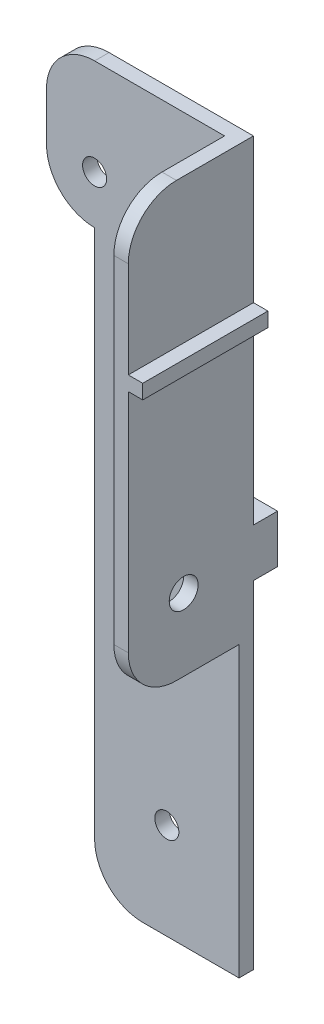
ISO-10303-21;
HEADER;
FILE_DESCRIPTION(('STEP AP214'),'2;1');
FILE_NAME('part.step','',(''),(''),'','','');
FILE_SCHEMA(('AUTOMOTIVE_DESIGN { 1 0 10303 214 1 1 1 1 }'));
ENDSEC;
DATA;
#1=APPLICATION_CONTEXT('core data for automotive mechanical design processes');
#2=APPLICATION_PROTOCOL_DEFINITION('international standard','automotive_design',2000,#1);
#3=PRODUCT_CONTEXT('',#1,'mechanical');
#4=PRODUCT('Part','Part','',(#3));
#5=PRODUCT_RELATED_PRODUCT_CATEGORY('part','',(#4));
#6=PRODUCT_DEFINITION_FORMATION('','',#4);
#7=PRODUCT_DEFINITION_CONTEXT('part definition',#1,'design');
#8=PRODUCT_DEFINITION('design','',#6,#7);
#9=PRODUCT_DEFINITION_SHAPE('','',#8);
#10=(LENGTH_UNIT() NAMED_UNIT(*) SI_UNIT(.MILLI.,.METRE.));
#11=(NAMED_UNIT(*) PLANE_ANGLE_UNIT() SI_UNIT($,.RADIAN.));
#12=(NAMED_UNIT(*) SI_UNIT($,.STERADIAN.) SOLID_ANGLE_UNIT());
#13=UNCERTAINTY_MEASURE_WITH_UNIT(LENGTH_MEASURE(1.E-05),#10,'distance_accuracy_value','');
#14=(GEOMETRIC_REPRESENTATION_CONTEXT(3) GLOBAL_UNCERTAINTY_ASSIGNED_CONTEXT((#13)) GLOBAL_UNIT_ASSIGNED_CONTEXT((#10,
#11,#12)) REPRESENTATION_CONTEXT('',''));
#15=CARTESIAN_POINT('',(0.,0.,0.));
#16=DIRECTION('',(0.,0.,1.));
#17=DIRECTION('',(1.,0.,0.));
#18=AXIS2_PLACEMENT_3D('',#15,#16,#17);
#19=CARTESIAN_POINT('',(30.,0.,-3.));
#20=DIRECTION('',(1.,0.,0.));
#21=DIRECTION('',(0.,0.,-1.));
#22=AXIS2_PLACEMENT_3D('',#19,#20,#21);
#23=PLANE('',#22);
#24=DIRECTION('',(0.,0.,1.));
#25=VECTOR('',#24,1.);
#26=CARTESIAN_POINT('',(30.,150.,-3.));
#27=LINE('',#26,#25);
#28=CARTESIAN_POINT('',(30.,150.,-3.));
#29=VERTEX_POINT('',#28);
#30=CARTESIAN_POINT('',(30.,150.,13.));
#31=VERTEX_POINT('',#30);
#32=EDGE_CURVE('E276',#29,#31,#27,.T.);
#33=ORIENTED_EDGE('',*,*,#32,.T.);
#34=CARTESIAN_POINT('',(30.,140.,13.));
#35=DIRECTION('',(1.,0.,0.));
#36=DIRECTION('',(0.,0.,-1.));
#37=AXIS2_PLACEMENT_3D('',#34,#35,#36);
#38=CIRCLE('',#37,10.);
#39=CARTESIAN_POINT('',(30.,140.,23.));
#40=VERTEX_POINT('',#39);
#41=EDGE_CURVE('E314',#31,#40,#38,.T.);
#42=ORIENTED_EDGE('',*,*,#41,.T.);
#43=DIRECTION('',(0.,-1.,0.));
#44=VECTOR('',#43,1.);
#45=CARTESIAN_POINT('',(30.,150.,23.));
#46=LINE('',#45,#44);
#47=CARTESIAN_POINT('',(30.,120.,23.));
#48=VERTEX_POINT('',#47);
#49=EDGE_CURVE('E213',#40,#48,#46,.T.);
#50=ORIENTED_EDGE('',*,*,#49,.T.);
#51=DIRECTION('',(0.,0.,-1.));
#52=VECTOR('',#51,1.);
#53=CARTESIAN_POINT('',(30.,120.,0.));
#54=LINE('',#53,#52);
#55=CARTESIAN_POINT('',(30.,120.,-3.));
#56=VERTEX_POINT('',#55);
#57=EDGE_CURVE('E704',#48,#56,#54,.T.);
#58=ORIENTED_EDGE('',*,*,#57,.T.);
#59=DIRECTION('',(0.,1.,0.));
#60=VECTOR('',#59,1.);
#61=CARTESIAN_POINT('',(30.,0.,-3.));
#62=LINE('',#61,#60);
#63=EDGE_CURVE('E266',#56,#29,#62,.T.);
#64=ORIENTED_EDGE('',*,*,#63,.T.);
#65=EDGE_LOOP('',(#33,#42,#50,#58,#64));
#66=FACE_BOUND('',#65,.T.);
#67=ADVANCED_FACE('F34',(#66),#23,.T.);
#68=CARTESIAN_POINT('',(0.,0.,-3.));
#69=DIRECTION('',(1.,0.,0.));
#70=DIRECTION('',(0.,0.,-1.));
#71=AXIS2_PLACEMENT_3D('',#68,#69,#70);
#72=PLANE('',#71);
#73=DIRECTION('',(0.,1.,0.));
#74=VECTOR('',#73,1.);
#75=CARTESIAN_POINT('',(0.,0.,-3.));
#76=LINE('',#75,#74);
#77=CARTESIAN_POINT('',(0.,10.,-3.));
#78=VERTEX_POINT('',#77);
#79=CARTESIAN_POINT('',(0.,70.,-3.));
#80=VERTEX_POINT('',#79);
#81=EDGE_CURVE('E223',#78,#80,#76,.T.);
#82=ORIENTED_EDGE('',*,*,#81,.F.);
#83=DIRECTION('',(0.,0.,1.));
#84=VECTOR('',#83,1.);
#85=CARTESIAN_POINT('',(0.,10.,0.));
#86=LINE('',#85,#84);
#87=CARTESIAN_POINT('',(0.,10.,0.));
#88=VERTEX_POINT('',#87);
#89=EDGE_CURVE('E289',#78,#88,#86,.T.);
#90=ORIENTED_EDGE('',*,*,#89,.T.);
#91=DIRECTION('',(0.,1.,0.));
#92=VECTOR('',#91,1.);
#93=CARTESIAN_POINT('',(0.,0.,0.));
#94=LINE('',#93,#92);
#95=CARTESIAN_POINT('',(0.,120.,0.));
#96=VERTEX_POINT('',#95);
#97=EDGE_CURVE('E263',#88,#96,#94,.T.);
#98=ORIENTED_EDGE('',*,*,#97,.T.);
#99=DIRECTION('',(0.,0.,1.));
#100=VECTOR('',#99,1.);
#101=CARTESIAN_POINT('',(0.,120.,-3.));
#102=LINE('',#101,#100);
#103=CARTESIAN_POINT('',(0.,120.,-3.));
#104=VERTEX_POINT('',#103);
#105=EDGE_CURVE('E286',#104,#96,#102,.T.);
#106=ORIENTED_EDGE('',*,*,#105,.F.);
#107=DIRECTION('',(0.,1.,0.));
#108=VECTOR('',#107,1.);
#109=CARTESIAN_POINT('',(0.,0.,-3.));
#110=LINE('',#109,#108);
#111=CARTESIAN_POINT('',(0.,80.,-3.));
#112=VERTEX_POINT('',#111);
#113=EDGE_CURVE('E274',#112,#104,#110,.T.);
#114=ORIENTED_EDGE('',*,*,#113,.F.);
#115=DIRECTION('',(0.,0.,1.));
#116=VECTOR('',#115,1.);
#117=CARTESIAN_POINT('',(0.,80.,-8.));
#118=LINE('',#117,#116);
#119=CARTESIAN_POINT('',(0.,80.,-8.));
#120=VERTEX_POINT('',#119);
#121=EDGE_CURVE('E249',#120,#112,#118,.T.);
#122=ORIENTED_EDGE('',*,*,#121,.F.);
#123=DIRECTION('',(0.,-1.,0.));
#124=VECTOR('',#123,1.);
#125=CARTESIAN_POINT('',(0.,80.,-8.));
#126=LINE('',#125,#124);
#127=CARTESIAN_POINT('',(0.,70.,-8.));
#128=VERTEX_POINT('',#127);
#129=EDGE_CURVE('E236',#120,#128,#126,.T.);
#130=ORIENTED_EDGE('',*,*,#129,.T.);
#131=DIRECTION('',(0.,0.,1.));
#132=VECTOR('',#131,1.);
#133=CARTESIAN_POINT('',(0.,70.,-8.));
#134=LINE('',#133,#132);
#135=EDGE_CURVE('E248',#128,#80,#134,.T.);
#136=ORIENTED_EDGE('',*,*,#135,.T.);
#137=EDGE_LOOP('',(#82,#90,#98,#106,#114,#122,#130,#136));
#138=FACE_BOUND('',#137,.T.);
#139=ADVANCED_FACE('F342',(#138),#72,.F.);
#140=CARTESIAN_POINT('',(-9.99999999999998,0.,-3.));
#141=DIRECTION('',(-1.,0.,0.));
#142=DIRECTION('',(0.,-1.,0.));
#143=AXIS2_PLACEMENT_3D('',#140,#141,#142);
#144=PLANE('',#143);
#145=DIRECTION('',(0.,-1.,0.));
#146=VECTOR('',#145,1.);
#147=CARTESIAN_POINT('',(-9.99999999999998,0.,-3.));
#148=LINE('',#147,#146);
#149=CARTESIAN_POINT('',(-10.,140.,-3.));
#150=VERTEX_POINT('',#149);
#151=CARTESIAN_POINT('',(-10.,130.,-3.));
#152=VERTEX_POINT('',#151);
#153=EDGE_CURVE('E271',#150,#152,#148,.T.);
#154=ORIENTED_EDGE('',*,*,#153,.T.);
#155=DIRECTION('',(0.,0.,1.));
#156=VECTOR('',#155,1.);
#157=CARTESIAN_POINT('',(-10.,130.,0.));
#158=LINE('',#157,#156);
#159=CARTESIAN_POINT('',(-10.,130.,0.));
#160=VERTEX_POINT('',#159);
#161=EDGE_CURVE('E318',#152,#160,#158,.T.);
#162=ORIENTED_EDGE('',*,*,#161,.T.);
#163=DIRECTION('',(0.,-1.,0.));
#164=VECTOR('',#163,1.);
#165=CARTESIAN_POINT('',(-9.99999999999998,0.,0.));
#166=LINE('',#165,#164);
#167=CARTESIAN_POINT('',(-10.,140.,0.));
#168=VERTEX_POINT('',#167);
#169=EDGE_CURVE('E281',#168,#160,#166,.T.);
#170=ORIENTED_EDGE('',*,*,#169,.F.);
#171=DIRECTION('',(0.,0.,1.));
#172=VECTOR('',#171,1.);
#173=CARTESIAN_POINT('',(-10.,140.,-3.));
#174=LINE('',#173,#172);
#175=EDGE_CURVE('E316',#168,#150,#174,.F.);
#176=ORIENTED_EDGE('',*,*,#175,.T.);
#177=EDGE_LOOP('',(#154,#162,#170,#176));
#178=FACE_BOUND('',#177,.T.);
#179=ADVANCED_FACE('F336',(#178),#144,.T.);
#180=CARTESIAN_POINT('',(0.,150.,-3.));
#181=DIRECTION('',(0.,-1.,0.));
#182=DIRECTION('',(0.,0.,-1.));
#183=AXIS2_PLACEMENT_3D('',#180,#181,#182);
#184=PLANE('',#183);
#185=DIRECTION('',(0.,0.,-1.));
#186=VECTOR('',#185,1.);
#187=CARTESIAN_POINT('',(27.,150.,23.));
#188=LINE('',#187,#186);
#189=CARTESIAN_POINT('',(27.,150.,13.));
#190=VERTEX_POINT('',#189);
#191=CARTESIAN_POINT('',(27.,150.,0.));
#192=VERTEX_POINT('',#191);
#193=EDGE_CURVE('E201',#190,#192,#188,.T.);
#194=ORIENTED_EDGE('',*,*,#193,.F.);
#195=DIRECTION('',(-1.,0.,0.));
#196=VECTOR('',#195,1.);
#197=CARTESIAN_POINT('',(30.,150.,13.));
#198=LINE('',#197,#196);
#199=EDGE_CURVE('E312',#190,#31,#198,.F.);
#200=ORIENTED_EDGE('',*,*,#199,.T.);
#201=ORIENTED_EDGE('',*,*,#32,.F.);
#202=DIRECTION('',(1.,0.,0.));
#203=VECTOR('',#202,1.);
#204=CARTESIAN_POINT('',(0.,150.,-3.));
#205=LINE('',#204,#203);
#206=CARTESIAN_POINT('',(0.,150.,-3.));
#207=VERTEX_POINT('',#206);
#208=EDGE_CURVE('E269',#207,#29,#205,.T.);
#209=ORIENTED_EDGE('',*,*,#208,.F.);
#210=DIRECTION('',(0.,0.,1.));
#211=VECTOR('',#210,1.);
#212=CARTESIAN_POINT('',(0.,150.,0.));
#213=LINE('',#212,#211);
#214=CARTESIAN_POINT('',(0.,150.,0.));
#215=VERTEX_POINT('',#214);
#216=EDGE_CURVE('E309',#207,#215,#213,.T.);
#217=ORIENTED_EDGE('',*,*,#216,.T.);
#218=DIRECTION('',(1.,0.,0.));
#219=VECTOR('',#218,1.);
#220=CARTESIAN_POINT('',(0.,150.,0.));
#221=LINE('',#220,#219);
#222=EDGE_CURVE('E279',#215,#192,#221,.T.);
#223=ORIENTED_EDGE('',*,*,#222,.T.);
#224=EDGE_LOOP('',(#194,#200,#201,#209,#217,#223));
#225=FACE_BOUND('',#224,.T.);
#226=ADVANCED_FACE('F423',(#225),#184,.F.);
#227=CARTESIAN_POINT('',(0.,130.,-3.));
#228=DIRECTION('',(0.,0.,1.));
#229=DIRECTION('',(1.,0.,0.));
#230=AXIS2_PLACEMENT_3D('',#227,#228,#229);
#231=CYLINDRICAL_SURFACE('',#230,2.5);
#232=CARTESIAN_POINT('',(0.,130.,-3.));
#233=DIRECTION('',(0.,0.,1.));
#234=DIRECTION('',(1.,0.,0.));
#235=AXIS2_PLACEMENT_3D('',#232,#233,#234);
#236=CIRCLE('',#235,2.5);
#237=CARTESIAN_POINT('',(2.5,130.,-3.));
#238=VERTEX_POINT('',#237);
#239=EDGE_CURVE('E259',#238,#238,#236,.T.);
#240=ORIENTED_EDGE('',*,*,#239,.F.);
#241=EDGE_LOOP('',(#240));
#242=FACE_BOUND('',#241,.T.);
#243=CARTESIAN_POINT('',(0.,130.,0.));
#244=DIRECTION('',(0.,0.,1.));
#245=DIRECTION('',(1.,0.,0.));
#246=AXIS2_PLACEMENT_3D('',#243,#244,#245);
#247=CIRCLE('',#246,2.5);
#248=CARTESIAN_POINT('',(2.5,130.,0.));
#249=VERTEX_POINT('',#248);
#250=EDGE_CURVE('E251',#249,#249,#247,.T.);
#251=ORIENTED_EDGE('',*,*,#250,.T.);
#252=EDGE_LOOP('',(#251));
#253=FACE_BOUND('',#252,.T.);
#254=ADVANCED_FACE('F415',(#242,#253),#231,.F.);
#255=CARTESIAN_POINT('',(30.,117.,23.));
#256=VERTEX_POINT('',#255);
#257=CARTESIAN_POINT('',(30.,70.,23.));
#258=VERTEX_POINT('',#257);
#259=EDGE_CURVE('E206',#256,#258,#46,.T.);
#260=ORIENTED_EDGE('',*,*,#259,.T.);
#261=CARTESIAN_POINT('',(30.,70.,13.));
#262=DIRECTION('',(1.,0.,0.));
#263=DIRECTION('',(0.,0.,-1.));
#264=AXIS2_PLACEMENT_3D('',#261,#262,#263);
#265=CIRCLE('',#264,10.);
#266=CARTESIAN_POINT('',(30.,60.,13.));
#267=VERTEX_POINT('',#266);
#268=EDGE_CURVE('E11',#258,#267,#265,.T.);
#269=ORIENTED_EDGE('',*,*,#268,.T.);
#270=DIRECTION('',(0.,0.,1.));
#271=VECTOR('',#270,1.);
#272=CARTESIAN_POINT('',(30.,60.,0.));
#273=LINE('',#272,#271);
#274=CARTESIAN_POINT('',(30.,60.,0.));
#275=VERTEX_POINT('',#274);
#276=EDGE_CURVE('E197',#275,#267,#273,.T.);
#277=ORIENTED_EDGE('',*,*,#276,.F.);
#278=DIRECTION('',(0.,1.,0.));
#279=VECTOR('',#278,1.);
#280=CARTESIAN_POINT('',(30.,0.,0.));
#281=LINE('',#280,#279);
#282=CARTESIAN_POINT('',(30.,0.,0.));
#283=VERTEX_POINT('',#282);
#284=EDGE_CURVE('E186',#283,#275,#281,.T.);
#285=ORIENTED_EDGE('',*,*,#284,.F.);
#286=DIRECTION('',(0.,0.,1.));
#287=VECTOR('',#286,1.);
#288=CARTESIAN_POINT('',(30.,0.,-3.));
#289=LINE('',#288,#287);
#290=CARTESIAN_POINT('',(30.,0.,-3.));
#291=VERTEX_POINT('',#290);
#292=EDGE_CURVE('E230',#291,#283,#289,.T.);
#293=ORIENTED_EDGE('',*,*,#292,.F.);
#294=DIRECTION('',(0.,1.,0.));
#295=VECTOR('',#294,1.);
#296=CARTESIAN_POINT('',(30.,0.,-3.));
#297=LINE('',#296,#295);
#298=CARTESIAN_POINT('',(30.,70.,-3.));
#299=VERTEX_POINT('',#298);
#300=EDGE_CURVE('E227',#291,#299,#297,.T.);
#301=ORIENTED_EDGE('',*,*,#300,.T.);
#302=DIRECTION('',(0.,0.,1.));
#303=VECTOR('',#302,1.);
#304=CARTESIAN_POINT('',(30.,70.,-8.));
#305=LINE('',#304,#303);
#306=CARTESIAN_POINT('',(30.,70.,-8.));
#307=VERTEX_POINT('',#306);
#308=EDGE_CURVE('E255',#307,#299,#305,.T.);
#309=ORIENTED_EDGE('',*,*,#308,.F.);
#310=DIRECTION('',(0.,1.,0.));
#311=VECTOR('',#310,1.);
#312=CARTESIAN_POINT('',(30.,80.,-8.));
#313=LINE('',#312,#311);
#314=CARTESIAN_POINT('',(30.,80.,-8.));
#315=VERTEX_POINT('',#314);
#316=EDGE_CURVE('E242',#307,#315,#313,.T.);
#317=ORIENTED_EDGE('',*,*,#316,.T.);
#318=DIRECTION('',(0.,0.,1.));
#319=VECTOR('',#318,1.);
#320=CARTESIAN_POINT('',(30.,80.,-8.));
#321=LINE('',#320,#319);
#322=CARTESIAN_POINT('',(30.,80.,-3.));
#323=VERTEX_POINT('',#322);
#324=EDGE_CURVE('E252',#315,#323,#321,.T.);
#325=ORIENTED_EDGE('',*,*,#324,.T.);
#326=CARTESIAN_POINT('',(30.,117.,-3.));
#327=VERTEX_POINT('',#326);
#328=EDGE_CURVE('E267',#323,#327,#62,.T.);
#329=ORIENTED_EDGE('',*,*,#328,.T.);
#330=DIRECTION('',(0.,0.,-1.));
#331=VECTOR('',#330,1.);
#332=CARTESIAN_POINT('',(30.,117.,0.));
#333=LINE('',#332,#331);
#334=EDGE_CURVE('E190',#256,#327,#333,.T.);
#335=ORIENTED_EDGE('',*,*,#334,.F.);
#336=EDGE_LOOP('',(#260,#269,#277,#285,#293,#301,#309,#317,#325,#329,#335));
#337=FACE_BOUND('',#336,.T.);
#338=CARTESIAN_POINT('',(30.,75.,11.5));
#339=DIRECTION('',(1.,0.,0.));
#340=DIRECTION('',(0.,0.,-1.));
#341=AXIS2_PLACEMENT_3D('',#338,#339,#340);
#342=CIRCLE('',#341,3.);
#343=CARTESIAN_POINT('',(30.,75.,8.5));
#344=VERTEX_POINT('',#343);
#345=EDGE_CURVE('E204',#344,#344,#342,.T.);
#346=ORIENTED_EDGE('',*,*,#345,.F.);
#347=EDGE_LOOP('',(#346));
#348=FACE_BOUND('',#347,.T.);
#349=ADVANCED_FACE('F355',(#337,#348),#23,.T.);
#350=CARTESIAN_POINT('',(0.,0.,-3.));
#351=DIRECTION('',(0.,0.,1.));
#352=DIRECTION('',(1.,0.,0.));
#353=AXIS2_PLACEMENT_3D('',#350,#351,#352);
#354=PLANE('',#353);
#355=ORIENTED_EDGE('',*,*,#239,.T.);
#356=EDGE_LOOP('',(#355));
#357=FACE_BOUND('',#356,.T.);
#358=ORIENTED_EDGE('',*,*,#113,.T.);
#359=CARTESIAN_POINT('',(0.,130.,-3.));
#360=DIRECTION('',(0.,0.,1.));
#361=DIRECTION('',(1.,0.,0.));
#362=AXIS2_PLACEMENT_3D('',#359,#360,#361);
#363=CIRCLE('',#362,10.);
#364=EDGE_CURVE('E323',#104,#152,#363,.F.);
#365=ORIENTED_EDGE('',*,*,#364,.T.);
#366=ORIENTED_EDGE('',*,*,#153,.F.);
#367=CARTESIAN_POINT('',(0.,140.,-3.));
#368=DIRECTION('',(0.,0.,1.));
#369=DIRECTION('',(1.,0.,0.));
#370=AXIS2_PLACEMENT_3D('',#367,#368,#369);
#371=CIRCLE('',#370,10.);
#372=EDGE_CURVE('E321',#150,#207,#371,.F.);
#373=ORIENTED_EDGE('',*,*,#372,.T.);
#374=ORIENTED_EDGE('',*,*,#208,.T.);
#375=ORIENTED_EDGE('',*,*,#63,.F.);
#376=DIRECTION('',(-1.,0.,0.));
#377=VECTOR('',#376,1.);
#378=CARTESIAN_POINT('',(33.,120.,-3.));
#379=LINE('',#378,#377);
#380=CARTESIAN_POINT('',(33.,120.,-3.));
#381=VERTEX_POINT('',#380);
#382=EDGE_CURVE('E380',#381,#56,#379,.T.);
#383=ORIENTED_EDGE('',*,*,#382,.F.);
#384=DIRECTION('',(0.,1.,0.));
#385=VECTOR('',#384,1.);
#386=CARTESIAN_POINT('',(33.,0.,-3.));
#387=LINE('',#386,#385);
#388=CARTESIAN_POINT('',(33.,117.,-3.));
#389=VERTEX_POINT('',#388);
#390=EDGE_CURVE('E377',#389,#381,#387,.T.);
#391=ORIENTED_EDGE('',*,*,#390,.F.);
#392=DIRECTION('',(-1.,0.,0.));
#393=VECTOR('',#392,1.);
#394=CARTESIAN_POINT('',(33.,117.,-3.));
#395=LINE('',#394,#393);
#396=EDGE_CURVE('E375',#389,#327,#395,.T.);
#397=ORIENTED_EDGE('',*,*,#396,.T.);
#398=ORIENTED_EDGE('',*,*,#328,.F.);
#399=DIRECTION('',(-1.,0.,0.));
#400=VECTOR('',#399,1.);
#401=CARTESIAN_POINT('',(0.,80.,-3.));
#402=LINE('',#401,#400);
#403=EDGE_CURVE('E262',#323,#112,#402,.T.);
#404=ORIENTED_EDGE('',*,*,#403,.T.);
#405=EDGE_LOOP('',(#358,#365,#366,#373,#374,#375,#383,#391,#397,#398,#404));
#406=FACE_BOUND('',#405,.T.);
#407=ADVANCED_FACE('F329',(#357,#406),#354,.F.);
#408=CARTESIAN_POINT('',(0.,0.,0.));
#409=DIRECTION('',(0.,0.,1.));
#410=DIRECTION('',(1.,0.,0.));
#411=AXIS2_PLACEMENT_3D('',#408,#409,#410);
#412=PLANE('',#411);
#413=ORIENTED_EDGE('',*,*,#97,.F.);
#414=CARTESIAN_POINT('',(10.,10.,0.));
#415=DIRECTION('',(0.,0.,1.));
#416=DIRECTION('',(1.,0.,0.));
#417=AXIS2_PLACEMENT_3D('',#414,#415,#416);
#418=CIRCLE('',#417,10.);
#419=CARTESIAN_POINT('',(10.,0.,0.));
#420=VERTEX_POINT('',#419);
#421=EDGE_CURVE('E298',#88,#420,#418,.T.);
#422=ORIENTED_EDGE('',*,*,#421,.T.);
#423=DIRECTION('',(1.,0.,0.));
#424=VECTOR('',#423,1.);
#425=CARTESIAN_POINT('',(0.,0.,0.));
#426=LINE('',#425,#424);
#427=EDGE_CURVE('E220',#420,#283,#426,.T.);
#428=ORIENTED_EDGE('',*,*,#427,.T.);
#429=ORIENTED_EDGE('',*,*,#284,.T.);
#430=DIRECTION('',(1.,0.,0.));
#431=VECTOR('',#430,1.);
#432=CARTESIAN_POINT('',(27.,60.,0.));
#433=LINE('',#432,#431);
#434=CARTESIAN_POINT('',(27.,60.,0.));
#435=VERTEX_POINT('',#434);
#436=EDGE_CURVE('E177',#435,#275,#433,.T.);
#437=ORIENTED_EDGE('',*,*,#436,.F.);
#438=DIRECTION('',(0.,-1.,0.));
#439=VECTOR('',#438,1.);
#440=CARTESIAN_POINT('',(27.,150.,0.));
#441=LINE('',#440,#439);
#442=EDGE_CURVE('E184',#192,#435,#441,.T.);
#443=ORIENTED_EDGE('',*,*,#442,.F.);
#444=ORIENTED_EDGE('',*,*,#222,.F.);
#445=CARTESIAN_POINT('',(0.,140.,0.));
#446=DIRECTION('',(0.,0.,1.));
#447=DIRECTION('',(1.,0.,0.));
#448=AXIS2_PLACEMENT_3D('',#445,#446,#447);
#449=CIRCLE('',#448,10.);
#450=EDGE_CURVE('E294',#215,#168,#449,.T.);
#451=ORIENTED_EDGE('',*,*,#450,.T.);
#452=ORIENTED_EDGE('',*,*,#169,.T.);
#453=CARTESIAN_POINT('',(0.,130.,0.));
#454=DIRECTION('',(0.,0.,1.));
#455=DIRECTION('',(1.,0.,0.));
#456=AXIS2_PLACEMENT_3D('',#453,#454,#455);
#457=CIRCLE('',#456,10.);
#458=EDGE_CURVE('E296',#160,#96,#457,.T.);
#459=ORIENTED_EDGE('',*,*,#458,.T.);
#460=EDGE_LOOP('',(#413,#422,#428,#429,#437,#443,#444,#451,#452,#459));
#461=FACE_BOUND('',#460,.T.);
#462=ORIENTED_EDGE('',*,*,#250,.F.);
#463=EDGE_LOOP('',(#462));
#464=FACE_BOUND('',#463,.T.);
#465=CARTESIAN_POINT('',(15.,20.,0.));
#466=DIRECTION('',(0.,0.,1.));
#467=DIRECTION('',(1.,0.,0.));
#468=AXIS2_PLACEMENT_3D('',#465,#466,#467);
#469=CIRCLE('',#468,2.5);
#470=CARTESIAN_POINT('',(17.5,20.,0.));
#471=VERTEX_POINT('',#470);
#472=EDGE_CURVE('E215',#471,#471,#469,.T.);
#473=ORIENTED_EDGE('',*,*,#472,.F.);
#474=EDGE_LOOP('',(#473));
#475=FACE_BOUND('',#474,.T.);
#476=ADVANCED_FACE('F180',(#461,#464,#475),#412,.T.);
#477=CARTESIAN_POINT('',(0.,80.,-8.));
#478=DIRECTION('',(0.,1.,0.));
#479=DIRECTION('',(0.,0.,1.));
#480=AXIS2_PLACEMENT_3D('',#477,#478,#479);
#481=PLANE('',#480);
#482=ORIENTED_EDGE('',*,*,#403,.F.);
#483=ORIENTED_EDGE('',*,*,#324,.F.);
#484=DIRECTION('',(-1.,0.,0.));
#485=VECTOR('',#484,1.);
#486=CARTESIAN_POINT('',(0.,80.,-8.));
#487=LINE('',#486,#485);
#488=EDGE_CURVE('E245',#315,#120,#487,.T.);
#489=ORIENTED_EDGE('',*,*,#488,.T.);
#490=ORIENTED_EDGE('',*,*,#121,.T.);
#491=EDGE_LOOP('',(#482,#483,#489,#490));
#492=FACE_BOUND('',#491,.T.);
#493=ADVANCED_FACE('F369',(#492),#481,.T.);
#494=CARTESIAN_POINT('',(0.,70.,-8.));
#495=DIRECTION('',(0.,-1.,0.));
#496=DIRECTION('',(0.,0.,-1.));
#497=AXIS2_PLACEMENT_3D('',#494,#495,#496);
#498=PLANE('',#497);
#499=DIRECTION('',(1.,0.,0.));
#500=VECTOR('',#499,1.);
#501=CARTESIAN_POINT('',(0.,70.,-3.));
#502=LINE('',#501,#500);
#503=EDGE_CURVE('E219',#80,#299,#502,.T.);
#504=ORIENTED_EDGE('',*,*,#503,.F.);
#505=ORIENTED_EDGE('',*,*,#135,.F.);
#506=DIRECTION('',(1.,0.,0.));
#507=VECTOR('',#506,1.);
#508=CARTESIAN_POINT('',(0.,70.,-8.));
#509=LINE('',#508,#507);
#510=EDGE_CURVE('E239',#128,#307,#509,.T.);
#511=ORIENTED_EDGE('',*,*,#510,.T.);
#512=ORIENTED_EDGE('',*,*,#308,.T.);
#513=EDGE_LOOP('',(#504,#505,#511,#512));
#514=FACE_BOUND('',#513,.T.);
#515=ADVANCED_FACE('F361',(#514),#498,.T.);
#516=CARTESIAN_POINT('',(0.,0.,-8.));
#517=DIRECTION('',(0.,0.,1.));
#518=DIRECTION('',(1.,0.,0.));
#519=AXIS2_PLACEMENT_3D('',#516,#517,#518);
#520=PLANE('',#519);
#521=ORIENTED_EDGE('',*,*,#129,.F.);
#522=ORIENTED_EDGE('',*,*,#488,.F.);
#523=ORIENTED_EDGE('',*,*,#316,.F.);
#524=ORIENTED_EDGE('',*,*,#510,.F.);
#525=EDGE_LOOP('',(#521,#522,#523,#524));
#526=FACE_BOUND('',#525,.T.);
#527=ADVANCED_FACE('F366',(#526),#520,.F.);
#528=CARTESIAN_POINT('',(0.,0.,-3.));
#529=DIRECTION('',(0.,-1.,0.));
#530=DIRECTION('',(0.,0.,-1.));
#531=AXIS2_PLACEMENT_3D('',#528,#529,#530);
#532=PLANE('',#531);
#533=ORIENTED_EDGE('',*,*,#292,.T.);
#534=ORIENTED_EDGE('',*,*,#427,.F.);
#535=DIRECTION('',(0.,0.,1.));
#536=VECTOR('',#535,1.);
#537=CARTESIAN_POINT('',(10.,0.,-3.));
#538=LINE('',#537,#536);
#539=CARTESIAN_POINT('',(10.,0.,-3.));
#540=VERTEX_POINT('',#539);
#541=EDGE_CURVE('E300',#420,#540,#538,.F.);
#542=ORIENTED_EDGE('',*,*,#541,.T.);
#543=DIRECTION('',(1.,0.,0.));
#544=VECTOR('',#543,1.);
#545=CARTESIAN_POINT('',(0.,0.,-3.));
#546=LINE('',#545,#544);
#547=EDGE_CURVE('E225',#540,#291,#546,.T.);
#548=ORIENTED_EDGE('',*,*,#547,.T.);
#549=EDGE_LOOP('',(#533,#534,#542,#548));
#550=FACE_BOUND('',#549,.T.);
#551=ADVANCED_FACE('F350',(#550),#532,.T.);
#552=CARTESIAN_POINT('',(15.,20.,-3.));
#553=DIRECTION('',(0.,0.,1.));
#554=DIRECTION('',(1.,0.,0.));
#555=AXIS2_PLACEMENT_3D('',#552,#553,#554);
#556=CYLINDRICAL_SURFACE('',#555,2.5);
#557=CARTESIAN_POINT('',(15.,20.,-3.));
#558=DIRECTION('',(0.,0.,1.));
#559=DIRECTION('',(1.,0.,0.));
#560=AXIS2_PLACEMENT_3D('',#557,#558,#559);
#561=CIRCLE('',#560,2.5);
#562=CARTESIAN_POINT('',(17.5,20.,-3.));
#563=VERTEX_POINT('',#562);
#564=EDGE_CURVE('E216',#563,#563,#561,.T.);
#565=ORIENTED_EDGE('',*,*,#564,.F.);
#566=EDGE_LOOP('',(#565));
#567=FACE_BOUND('',#566,.T.);
#568=ORIENTED_EDGE('',*,*,#472,.T.);
#569=EDGE_LOOP('',(#568));
#570=FACE_BOUND('',#569,.T.);
#571=ADVANCED_FACE('F403',(#567,#570),#556,.F.);
#572=CARTESIAN_POINT('',(0.,0.,-3.));
#573=DIRECTION('',(0.,0.,1.));
#574=DIRECTION('',(1.,0.,0.));
#575=AXIS2_PLACEMENT_3D('',#572,#573,#574);
#576=PLANE('',#575);
#577=ORIENTED_EDGE('',*,*,#564,.T.);
#578=EDGE_LOOP('',(#577));
#579=FACE_BOUND('',#578,.T.);
#580=ORIENTED_EDGE('',*,*,#547,.F.);
#581=CARTESIAN_POINT('',(10.,10.,-3.));
#582=DIRECTION('',(0.,0.,1.));
#583=DIRECTION('',(1.,0.,0.));
#584=AXIS2_PLACEMENT_3D('',#581,#582,#583);
#585=CIRCLE('',#584,10.);
#586=EDGE_CURVE('E302',#540,#78,#585,.F.);
#587=ORIENTED_EDGE('',*,*,#586,.T.);
#588=ORIENTED_EDGE('',*,*,#81,.T.);
#589=ORIENTED_EDGE('',*,*,#503,.T.);
#590=ORIENTED_EDGE('',*,*,#300,.F.);
#591=EDGE_LOOP('',(#580,#587,#588,#589,#590));
#592=FACE_BOUND('',#591,.T.);
#593=ADVANCED_FACE('F358',(#579,#592),#576,.F.);
#594=CARTESIAN_POINT('',(27.,150.,23.));
#595=DIRECTION('',(1.,0.,0.));
#596=DIRECTION('',(0.,1.,0.));
#597=AXIS2_PLACEMENT_3D('',#594,#595,#596);
#598=PLANE('',#597);
#599=CARTESIAN_POINT('',(27.,75.,11.5));
#600=DIRECTION('',(-1.,0.,0.));
#601=DIRECTION('',(0.,-1.,0.));
#602=AXIS2_PLACEMENT_3D('',#599,#600,#601);
#603=CIRCLE('',#602,3.);
#604=CARTESIAN_POINT('',(27.,72.,11.5));
#605=VERTEX_POINT('',#604);
#606=EDGE_CURVE('E209',#605,#605,#603,.T.);
#607=ORIENTED_EDGE('',*,*,#606,.F.);
#608=EDGE_LOOP('',(#607));
#609=FACE_BOUND('',#608,.T.);
#610=DIRECTION('',(0.,0.,1.));
#611=VECTOR('',#610,1.);
#612=CARTESIAN_POINT('',(27.,60.,0.));
#613=LINE('',#612,#611);
#614=CARTESIAN_POINT('',(27.,60.,13.));
#615=VERTEX_POINT('',#614);
#616=EDGE_CURVE('E191',#435,#615,#613,.T.);
#617=ORIENTED_EDGE('',*,*,#616,.T.);
#618=CARTESIAN_POINT('',(27.,70.,13.));
#619=DIRECTION('',(1.,0.,0.));
#620=DIRECTION('',(0.,1.,0.));
#621=AXIS2_PLACEMENT_3D('',#618,#619,#620);
#622=CIRCLE('',#621,10.);
#623=CARTESIAN_POINT('',(27.,70.,23.));
#624=VERTEX_POINT('',#623);
#625=EDGE_CURVE('E56',#615,#624,#622,.F.);
#626=ORIENTED_EDGE('',*,*,#625,.T.);
#627=DIRECTION('',(0.,-1.,0.));
#628=VECTOR('',#627,1.);
#629=CARTESIAN_POINT('',(27.,150.,23.));
#630=LINE('',#629,#628);
#631=CARTESIAN_POINT('',(27.,140.,23.));
#632=VERTEX_POINT('',#631);
#633=EDGE_CURVE('E203',#632,#624,#630,.T.);
#634=ORIENTED_EDGE('',*,*,#633,.F.);
#635=CARTESIAN_POINT('',(27.,140.,13.));
#636=DIRECTION('',(1.,0.,0.));
#637=DIRECTION('',(0.,1.,0.));
#638=AXIS2_PLACEMENT_3D('',#635,#636,#637);
#639=CIRCLE('',#638,10.);
#640=EDGE_CURVE('E304',#632,#190,#639,.F.);
#641=ORIENTED_EDGE('',*,*,#640,.T.);
#642=ORIENTED_EDGE('',*,*,#193,.T.);
#643=ORIENTED_EDGE('',*,*,#442,.T.);
#644=EDGE_LOOP('',(#617,#626,#634,#641,#642,#643));
#645=FACE_BOUND('',#644,.T.);
#646=ADVANCED_FACE('F199',(#609,#645),#598,.F.);
#647=CARTESIAN_POINT('',(0.,0.,23.));
#648=DIRECTION('',(0.,0.,1.));
#649=DIRECTION('',(1.,0.,0.));
#650=AXIS2_PLACEMENT_3D('',#647,#648,#649);
#651=PLANE('',#650);
#652=ORIENTED_EDGE('',*,*,#633,.T.);
#653=DIRECTION('',(-1.,0.,0.));
#654=VECTOR('',#653,1.);
#655=CARTESIAN_POINT('',(30.,70.,23.));
#656=LINE('',#655,#654);
#657=EDGE_CURVE('E42',#624,#258,#656,.F.);
#658=ORIENTED_EDGE('',*,*,#657,.T.);
#659=ORIENTED_EDGE('',*,*,#259,.F.);
#660=DIRECTION('',(-1.,0.,0.));
#661=VECTOR('',#660,1.);
#662=CARTESIAN_POINT('',(33.,117.,23.));
#663=LINE('',#662,#661);
#664=CARTESIAN_POINT('',(33.,117.,23.));
#665=VERTEX_POINT('',#664);
#666=EDGE_CURVE('E379',#665,#256,#663,.T.);
#667=ORIENTED_EDGE('',*,*,#666,.F.);
#668=DIRECTION('',(0.,-1.,0.));
#669=VECTOR('',#668,1.);
#670=CARTESIAN_POINT('',(33.,0.,23.));
#671=LINE('',#670,#669);
#672=CARTESIAN_POINT('',(33.,120.,23.));
#673=VERTEX_POINT('',#672);
#674=EDGE_CURVE('E700',#673,#665,#671,.T.);
#675=ORIENTED_EDGE('',*,*,#674,.F.);
#676=DIRECTION('',(-1.,0.,0.));
#677=VECTOR('',#676,1.);
#678=CARTESIAN_POINT('',(33.,120.,23.));
#679=LINE('',#678,#677);
#680=EDGE_CURVE('E385',#673,#48,#679,.T.);
#681=ORIENTED_EDGE('',*,*,#680,.T.);
#682=ORIENTED_EDGE('',*,*,#49,.F.);
#683=DIRECTION('',(-1.,0.,0.));
#684=VECTOR('',#683,1.);
#685=CARTESIAN_POINT('',(27.,140.,23.));
#686=LINE('',#685,#684);
#687=EDGE_CURVE('E306',#40,#632,#686,.T.);
#688=ORIENTED_EDGE('',*,*,#687,.T.);
#689=EDGE_LOOP('',(#652,#658,#659,#667,#675,#681,#682,#688));
#690=FACE_BOUND('',#689,.T.);
#691=ADVANCED_FACE('F395',(#690),#651,.T.);
#692=CARTESIAN_POINT('',(50.,75.,11.5));
#693=DIRECTION('',(-1.,0.,0.));
#694=DIRECTION('',(0.,-1.,0.));
#695=AXIS2_PLACEMENT_3D('',#692,#693,#694);
#696=CYLINDRICAL_SURFACE('',#695,3.);
#697=ORIENTED_EDGE('',*,*,#345,.T.);
#698=EDGE_LOOP('',(#697));
#699=FACE_BOUND('',#698,.T.);
#700=ORIENTED_EDGE('',*,*,#606,.T.);
#701=EDGE_LOOP('',(#700));
#702=FACE_BOUND('',#701,.T.);
#703=ADVANCED_FACE('F392',(#699,#702),#696,.F.);
#704=CARTESIAN_POINT('',(33.,117.,0.));
#705=DIRECTION('',(0.,1.,0.));
#706=DIRECTION('',(0.,0.,1.));
#707=AXIS2_PLACEMENT_3D('',#704,#705,#706);
#708=PLANE('',#707);
#709=ORIENTED_EDGE('',*,*,#334,.T.);
#710=ORIENTED_EDGE('',*,*,#396,.F.);
#711=DIRECTION('',(0.,0.,-1.));
#712=VECTOR('',#711,1.);
#713=CARTESIAN_POINT('',(33.,117.,0.));
#714=LINE('',#713,#712);
#715=EDGE_CURVE('E701',#665,#389,#714,.T.);
#716=ORIENTED_EDGE('',*,*,#715,.F.);
#717=ORIENTED_EDGE('',*,*,#666,.T.);
#718=EDGE_LOOP('',(#709,#710,#716,#717));
#719=FACE_BOUND('',#718,.T.);
#720=ADVANCED_FACE('F526',(#719),#708,.F.);
#721=CARTESIAN_POINT('',(33.,120.,0.));
#722=DIRECTION('',(0.,1.,0.));
#723=DIRECTION('',(0.,0.,1.));
#724=AXIS2_PLACEMENT_3D('',#721,#722,#723);
#725=PLANE('',#724);
#726=ORIENTED_EDGE('',*,*,#57,.F.);
#727=ORIENTED_EDGE('',*,*,#680,.F.);
#728=DIRECTION('',(0.,0.,-1.));
#729=VECTOR('',#728,1.);
#730=CARTESIAN_POINT('',(33.,120.,0.));
#731=LINE('',#730,#729);
#732=EDGE_CURVE('E703',#673,#381,#731,.T.);
#733=ORIENTED_EDGE('',*,*,#732,.T.);
#734=ORIENTED_EDGE('',*,*,#382,.T.);
#735=EDGE_LOOP('',(#726,#727,#733,#734));
#736=FACE_BOUND('',#735,.T.);
#737=ADVANCED_FACE('F534',(#736),#725,.T.);
#738=CARTESIAN_POINT('',(33.,0.,0.));
#739=DIRECTION('',(1.,0.,0.));
#740=DIRECTION('',(0.,0.,-1.));
#741=AXIS2_PLACEMENT_3D('',#738,#739,#740);
#742=PLANE('',#741);
#743=ORIENTED_EDGE('',*,*,#674,.T.);
#744=ORIENTED_EDGE('',*,*,#715,.T.);
#745=ORIENTED_EDGE('',*,*,#390,.T.);
#746=ORIENTED_EDGE('',*,*,#732,.F.);
#747=EDGE_LOOP('',(#743,#744,#745,#746));
#748=FACE_BOUND('',#747,.T.);
#749=ADVANCED_FACE('F435',(#748),#742,.T.);
#750=CARTESIAN_POINT('',(10.,10.,-3.));
#751=DIRECTION('',(0.,0.,-1.));
#752=DIRECTION('',(-1.,0.,0.));
#753=AXIS2_PLACEMENT_3D('',#750,#751,#752);
#754=CYLINDRICAL_SURFACE('',#753,10.);
#755=ORIENTED_EDGE('',*,*,#586,.F.);
#756=ORIENTED_EDGE('',*,*,#541,.F.);
#757=ORIENTED_EDGE('',*,*,#421,.F.);
#758=ORIENTED_EDGE('',*,*,#89,.F.);
#759=EDGE_LOOP('',(#755,#756,#757,#758));
#760=FACE_BOUND('',#759,.T.);
#761=ADVANCED_FACE('F346',(#760),#754,.T.);
#762=CARTESIAN_POINT('',(0.,140.,13.));
#763=DIRECTION('',(1.,0.,0.));
#764=DIRECTION('',(0.,0.,-1.));
#765=AXIS2_PLACEMENT_3D('',#762,#763,#764);
#766=CYLINDRICAL_SURFACE('',#765,10.);
#767=ORIENTED_EDGE('',*,*,#41,.F.);
#768=ORIENTED_EDGE('',*,*,#199,.F.);
#769=ORIENTED_EDGE('',*,*,#640,.F.);
#770=ORIENTED_EDGE('',*,*,#687,.F.);
#771=EDGE_LOOP('',(#767,#768,#769,#770));
#772=FACE_BOUND('',#771,.T.);
#773=ADVANCED_FACE('F434',(#772),#766,.T.);
#774=CARTESIAN_POINT('',(0.,130.,-3.));
#775=DIRECTION('',(0.,0.,-1.));
#776=DIRECTION('',(-1.,0.,0.));
#777=AXIS2_PLACEMENT_3D('',#774,#775,#776);
#778=CYLINDRICAL_SURFACE('',#777,10.);
#779=ORIENTED_EDGE('',*,*,#364,.F.);
#780=ORIENTED_EDGE('',*,*,#105,.T.);
#781=ORIENTED_EDGE('',*,*,#458,.F.);
#782=ORIENTED_EDGE('',*,*,#161,.F.);
#783=EDGE_LOOP('',(#779,#780,#781,#782));
#784=FACE_BOUND('',#783,.T.);
#785=ADVANCED_FACE('F339',(#784),#778,.T.);
#786=CARTESIAN_POINT('',(0.,140.,-3.));
#787=DIRECTION('',(0.,0.,-1.));
#788=DIRECTION('',(-1.,0.,0.));
#789=AXIS2_PLACEMENT_3D('',#786,#787,#788);
#790=CYLINDRICAL_SURFACE('',#789,10.);
#791=ORIENTED_EDGE('',*,*,#372,.F.);
#792=ORIENTED_EDGE('',*,*,#175,.F.);
#793=ORIENTED_EDGE('',*,*,#450,.F.);
#794=ORIENTED_EDGE('',*,*,#216,.F.);
#795=EDGE_LOOP('',(#791,#792,#793,#794));
#796=FACE_BOUND('',#795,.T.);
#797=ADVANCED_FACE('F440',(#796),#790,.T.);
#798=CARTESIAN_POINT('',(27.,60.,0.));
#799=DIRECTION('',(0.,1.,0.));
#800=DIRECTION('',(0.,0.,1.));
#801=AXIS2_PLACEMENT_3D('',#798,#799,#800);
#802=PLANE('',#801);
#803=ORIENTED_EDGE('',*,*,#276,.T.);
#804=DIRECTION('',(-1.,0.,0.));
#805=VECTOR('',#804,1.);
#806=CARTESIAN_POINT('',(27.,60.,13.));
#807=LINE('',#806,#805);
#808=EDGE_CURVE('E196',#267,#615,#807,.T.);
#809=ORIENTED_EDGE('',*,*,#808,.T.);
#810=ORIENTED_EDGE('',*,*,#616,.F.);
#811=ORIENTED_EDGE('',*,*,#436,.T.);
#812=EDGE_LOOP('',(#803,#809,#810,#811));
#813=FACE_BOUND('',#812,.T.);
#814=ADVANCED_FACE('F194',(#813),#802,.F.);
#815=CARTESIAN_POINT('',(27.,70.,13.));
#816=DIRECTION('',(1.,0.,0.));
#817=DIRECTION('',(0.,0.,-1.));
#818=AXIS2_PLACEMENT_3D('',#815,#816,#817);
#819=CYLINDRICAL_SURFACE('',#818,10.);
#820=ORIENTED_EDGE('',*,*,#268,.F.);
#821=ORIENTED_EDGE('',*,*,#657,.F.);
#822=ORIENTED_EDGE('',*,*,#625,.F.);
#823=ORIENTED_EDGE('',*,*,#808,.F.);
#824=EDGE_LOOP('',(#820,#821,#822,#823));
#825=FACE_BOUND('',#824,.T.);
#826=ADVANCED_FACE('F36',(#825),#819,.T.);
#827=CLOSED_SHELL('',(#67,#139,#179,#226,#254,#349,#407,#476,#493,#515,#527,#551,#571,#593,#646,
#691,#703,#720,#737,#749,#761,#773,#785,#797,#814,#826));
#828=MANIFOLD_SOLID_BREP('B2',#827);
#829=ADVANCED_BREP_SHAPE_REPRESENTATION('',(#18,#828),#14);
#830=SHAPE_DEFINITION_REPRESENTATION(#9,#829);
ENDSEC;
END-ISO-10303-21;
